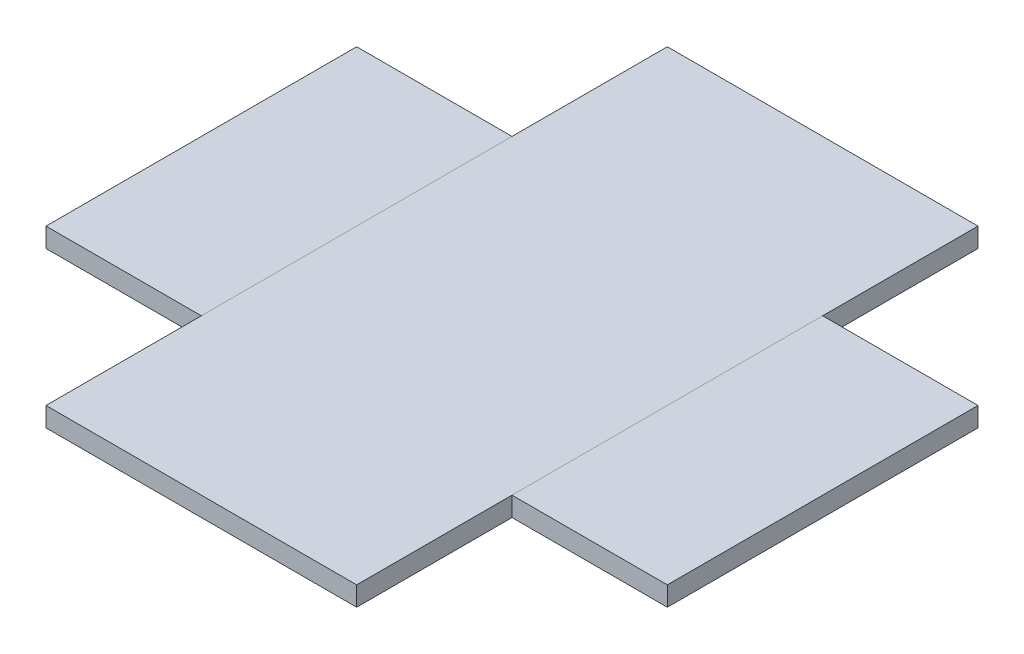
ISO-10303-21;
HEADER;
FILE_DESCRIPTION(('STEP AP214'),'2;1');
FILE_NAME('part.step','',(''),(''),'','','');
FILE_SCHEMA(('AUTOMOTIVE_DESIGN { 1 0 10303 214 1 1 1 1 }'));
ENDSEC;
DATA;
#1=APPLICATION_CONTEXT('core data for automotive mechanical design processes');
#2=APPLICATION_PROTOCOL_DEFINITION('international standard','automotive_design',2000,#1);
#3=PRODUCT_CONTEXT('',#1,'mechanical');
#4=PRODUCT('Part','Part','',(#3));
#5=PRODUCT_RELATED_PRODUCT_CATEGORY('part','',(#4));
#6=PRODUCT_DEFINITION_FORMATION('','',#4);
#7=PRODUCT_DEFINITION_CONTEXT('part definition',#1,'design');
#8=PRODUCT_DEFINITION('design','',#6,#7);
#9=PRODUCT_DEFINITION_SHAPE('','',#8);
#10=(LENGTH_UNIT() NAMED_UNIT(*) SI_UNIT(.MILLI.,.METRE.));
#11=(NAMED_UNIT(*) PLANE_ANGLE_UNIT() SI_UNIT($,.RADIAN.));
#12=(NAMED_UNIT(*) SI_UNIT($,.STERADIAN.) SOLID_ANGLE_UNIT());
#13=UNCERTAINTY_MEASURE_WITH_UNIT(LENGTH_MEASURE(1.E-05),#10,'distance_accuracy_value','');
#14=(GEOMETRIC_REPRESENTATION_CONTEXT(3) GLOBAL_UNCERTAINTY_ASSIGNED_CONTEXT((#13)) GLOBAL_UNIT_ASSIGNED_CONTEXT((#10,
#11,#12)) REPRESENTATION_CONTEXT('',''));
#15=CARTESIAN_POINT('',(0.,0.,0.));
#16=DIRECTION('',(0.,0.,1.));
#17=DIRECTION('',(1.,0.,0.));
#18=AXIS2_PLACEMENT_3D('',#15,#16,#17);
#19=CARTESIAN_POINT('',(0.,0.,0.));
#20=DIRECTION('',(0.,-1.,0.));
#21=DIRECTION('',(0.,0.,-1.));
#22=AXIS2_PLACEMENT_3D('',#19,#20,#21);
#23=PLANE('',#22);
#24=DIRECTION('',(0.,0.,-1.));
#25=VECTOR('',#24,1.);
#26=CARTESIAN_POINT('',(25.4,0.,50.8));
#27=LINE('',#26,#25);
#28=CARTESIAN_POINT('',(25.4,0.,50.8));
#29=VERTEX_POINT('',#28);
#30=CARTESIAN_POINT('',(25.4,0.,-50.8));
#31=VERTEX_POINT('',#30);
#32=EDGE_CURVE('E51',#29,#31,#27,.T.);
#33=ORIENTED_EDGE('',*,*,#32,.F.);
#34=DIRECTION('',(1.,0.,0.));
#35=VECTOR('',#34,1.);
#36=CARTESIAN_POINT('',(-25.4,0.,50.8));
#37=LINE('',#36,#35);
#38=CARTESIAN_POINT('',(-25.4,0.,50.8));
#39=VERTEX_POINT('',#38);
#40=EDGE_CURVE('E74',#39,#29,#37,.T.);
#41=ORIENTED_EDGE('',*,*,#40,.F.);
#42=DIRECTION('',(0.,0.,1.));
#43=VECTOR('',#42,1.);
#44=CARTESIAN_POINT('',(-25.4,0.,50.8));
#45=LINE('',#44,#43);
#46=CARTESIAN_POINT('',(-25.4,0.,-50.8));
#47=VERTEX_POINT('',#46);
#48=EDGE_CURVE('E79',#47,#39,#45,.T.);
#49=ORIENTED_EDGE('',*,*,#48,.F.);
#50=DIRECTION('',(-1.,0.,0.));
#51=VECTOR('',#50,1.);
#52=CARTESIAN_POINT('',(-25.4,0.,-50.8));
#53=LINE('',#52,#51);
#54=EDGE_CURVE('E94',#31,#47,#53,.T.);
#55=ORIENTED_EDGE('',*,*,#54,.F.);
#56=EDGE_LOOP('',(#33,#41,#49,#55));
#57=FACE_BOUND('',#56,.T.);
#58=ADVANCED_FACE('F43',(#57),#23,.T.);
#59=CARTESIAN_POINT('',(0.,3.175,0.));
#60=DIRECTION('',(0.,-1.,0.));
#61=DIRECTION('',(0.,0.,-1.));
#62=AXIS2_PLACEMENT_3D('',#59,#60,#61);
#63=PLANE('',#62);
#64=DIRECTION('',(0.,0.,-1.));
#65=VECTOR('',#64,1.);
#66=CARTESIAN_POINT('',(25.4,3.175,50.8));
#67=LINE('',#66,#65);
#68=CARTESIAN_POINT('',(25.4,3.175,50.8));
#69=VERTEX_POINT('',#68);
#70=CARTESIAN_POINT('',(25.4,3.175,-50.8));
#71=VERTEX_POINT('',#70);
#72=EDGE_CURVE('E103',#69,#71,#67,.T.);
#73=ORIENTED_EDGE('',*,*,#72,.T.);
#74=DIRECTION('',(-1.,0.,0.));
#75=VECTOR('',#74,1.);
#76=CARTESIAN_POINT('',(-25.4,3.175,-50.8));
#77=LINE('',#76,#75);
#78=CARTESIAN_POINT('',(-25.4,3.175,-50.8));
#79=VERTEX_POINT('',#78);
#80=EDGE_CURVE('E92',#71,#79,#77,.T.);
#81=ORIENTED_EDGE('',*,*,#80,.T.);
#82=DIRECTION('',(0.,0.,1.));
#83=VECTOR('',#82,1.);
#84=CARTESIAN_POINT('',(-25.4,3.175,50.8));
#85=LINE('',#84,#83);
#86=CARTESIAN_POINT('',(-25.4,3.175,50.8));
#87=VERTEX_POINT('',#86);
#88=EDGE_CURVE('E95',#79,#87,#85,.T.);
#89=ORIENTED_EDGE('',*,*,#88,.T.);
#90=DIRECTION('',(1.,0.,0.));
#91=VECTOR('',#90,1.);
#92=CARTESIAN_POINT('',(-25.4,3.175,50.8));
#93=LINE('',#92,#91);
#94=EDGE_CURVE('E100',#87,#69,#93,.T.);
#95=ORIENTED_EDGE('',*,*,#94,.T.);
#96=EDGE_LOOP('',(#73,#81,#89,#95));
#97=FACE_BOUND('',#96,.T.);
#98=ADVANCED_FACE('F102',(#97),#63,.F.);
#99=CARTESIAN_POINT('',(-25.4,-113.592253256989,-50.8));
#100=DIRECTION('',(0.,0.,-1.));
#101=DIRECTION('',(-1.,0.,0.));
#102=AXIS2_PLACEMENT_3D('',#99,#100,#101);
#103=PLANE('',#102);
#104=DIRECTION('',(0.,1.,0.));
#105=VECTOR('',#104,1.);
#106=CARTESIAN_POINT('',(25.4,-113.592253256989,-50.8));
#107=LINE('',#106,#105);
#108=EDGE_CURVE('E12',#31,#71,#107,.T.);
#109=ORIENTED_EDGE('',*,*,#108,.F.);
#110=ORIENTED_EDGE('',*,*,#54,.T.);
#111=DIRECTION('',(0.,1.,0.));
#112=VECTOR('',#111,1.);
#113=CARTESIAN_POINT('',(-25.4,-113.592253256989,-50.8));
#114=LINE('',#113,#112);
#115=EDGE_CURVE('E89',#47,#79,#114,.T.);
#116=ORIENTED_EDGE('',*,*,#115,.T.);
#117=ORIENTED_EDGE('',*,*,#80,.F.);
#118=EDGE_LOOP('',(#109,#110,#116,#117));
#119=FACE_BOUND('',#118,.T.);
#120=ADVANCED_FACE('F90',(#119),#103,.T.);
#121=CARTESIAN_POINT('',(-25.4,-113.592253256989,50.8));
#122=DIRECTION('',(-1.,0.,0.));
#123=DIRECTION('',(0.,0.,1.));
#124=AXIS2_PLACEMENT_3D('',#121,#122,#123);
#125=PLANE('',#124);
#126=ORIENTED_EDGE('',*,*,#115,.F.);
#127=ORIENTED_EDGE('',*,*,#48,.T.);
#128=DIRECTION('',(0.,1.,0.));
#129=VECTOR('',#128,1.);
#130=CARTESIAN_POINT('',(-25.4,-113.592253256989,50.8));
#131=LINE('',#130,#129);
#132=EDGE_CURVE('E84',#39,#87,#131,.T.);
#133=ORIENTED_EDGE('',*,*,#132,.T.);
#134=ORIENTED_EDGE('',*,*,#88,.F.);
#135=EDGE_LOOP('',(#126,#127,#133,#134));
#136=FACE_BOUND('',#135,.T.);
#137=ADVANCED_FACE('F96',(#136),#125,.T.);
#138=CARTESIAN_POINT('',(-25.4,-113.592253256989,50.8));
#139=DIRECTION('',(0.,0.,1.));
#140=DIRECTION('',(1.,0.,0.));
#141=AXIS2_PLACEMENT_3D('',#138,#139,#140);
#142=PLANE('',#141);
#143=ORIENTED_EDGE('',*,*,#132,.F.);
#144=ORIENTED_EDGE('',*,*,#40,.T.);
#145=DIRECTION('',(0.,1.,0.));
#146=VECTOR('',#145,1.);
#147=CARTESIAN_POINT('',(25.4,-113.592253256989,50.8));
#148=LINE('',#147,#146);
#149=EDGE_CURVE('E110',#29,#69,#148,.T.);
#150=ORIENTED_EDGE('',*,*,#149,.T.);
#151=ORIENTED_EDGE('',*,*,#94,.F.);
#152=EDGE_LOOP('',(#143,#144,#150,#151));
#153=FACE_BOUND('',#152,.T.);
#154=ADVANCED_FACE('F116',(#153),#142,.T.);
#155=CARTESIAN_POINT('',(25.4,-113.592253256989,50.8));
#156=DIRECTION('',(1.,0.,0.));
#157=DIRECTION('',(0.,0.,-1.));
#158=AXIS2_PLACEMENT_3D('',#155,#156,#157);
#159=PLANE('',#158);
#160=ORIENTED_EDGE('',*,*,#149,.F.);
#161=ORIENTED_EDGE('',*,*,#32,.T.);
#162=ORIENTED_EDGE('',*,*,#108,.T.);
#163=ORIENTED_EDGE('',*,*,#72,.F.);
#164=EDGE_LOOP('',(#160,#161,#162,#163));
#165=FACE_BOUND('',#164,.T.);
#166=ADVANCED_FACE('F117',(#165),#159,.T.);
#167=CLOSED_SHELL('',(#58,#98,#120,#137,#154,#166));
#168=MANIFOLD_SOLID_BREP('B2',#167);
#169=CARTESIAN_POINT('',(50.8,3.175,25.4));
#170=DIRECTION('',(-1.,0.,0.));
#171=DIRECTION('',(0.,0.,1.));
#172=AXIS2_PLACEMENT_3D('',#169,#170,#171);
#173=PLANE('',#172);
#174=DIRECTION('',(0.,0.,-1.));
#175=VECTOR('',#174,1.);
#176=CARTESIAN_POINT('',(50.8,0.,25.4));
#177=LINE('',#176,#175);
#178=CARTESIAN_POINT('',(50.8,0.,25.4));
#179=VERTEX_POINT('',#178);
#180=CARTESIAN_POINT('',(50.8,0.,-25.4));
#181=VERTEX_POINT('',#180);
#182=EDGE_CURVE('E230',#179,#181,#177,.T.);
#183=ORIENTED_EDGE('',*,*,#182,.T.);
#184=DIRECTION('',(0.,-1.,0.));
#185=VECTOR('',#184,1.);
#186=CARTESIAN_POINT('',(50.8,3.175,-25.4));
#187=LINE('',#186,#185);
#188=CARTESIAN_POINT('',(50.8,3.175,-25.4));
#189=VERTEX_POINT('',#188);
#190=EDGE_CURVE('E41',#189,#181,#187,.T.);
#191=ORIENTED_EDGE('',*,*,#190,.F.);
#192=DIRECTION('',(0.,0.,-1.));
#193=VECTOR('',#192,1.);
#194=CARTESIAN_POINT('',(50.8,3.175,25.4));
#195=LINE('',#194,#193);
#196=CARTESIAN_POINT('',(50.8,3.175,25.4));
#197=VERTEX_POINT('',#196);
#198=EDGE_CURVE('E218',#197,#189,#195,.T.);
#199=ORIENTED_EDGE('',*,*,#198,.F.);
#200=DIRECTION('',(0.,-1.,0.));
#201=VECTOR('',#200,1.);
#202=CARTESIAN_POINT('',(50.8,3.175,25.4));
#203=LINE('',#202,#201);
#204=EDGE_CURVE('E226',#197,#179,#203,.T.);
#205=ORIENTED_EDGE('',*,*,#204,.T.);
#206=EDGE_LOOP('',(#183,#191,#199,#205));
#207=FACE_BOUND('',#206,.T.);
#208=ADVANCED_FACE('F167',(#207),#173,.F.);
#209=CARTESIAN_POINT('',(-50.8,3.175,-25.4));
#210=DIRECTION('',(0.,0.,1.));
#211=DIRECTION('',(1.,0.,0.));
#212=AXIS2_PLACEMENT_3D('',#209,#210,#211);
#213=PLANE('',#212);
#214=DIRECTION('',(-1.,0.,0.));
#215=VECTOR('',#214,1.);
#216=CARTESIAN_POINT('',(-50.8,0.,-25.4));
#217=LINE('',#216,#215);
#218=CARTESIAN_POINT('',(-50.8,0.,-25.4));
#219=VERTEX_POINT('',#218);
#220=EDGE_CURVE('E222',#181,#219,#217,.T.);
#221=ORIENTED_EDGE('',*,*,#220,.T.);
#222=DIRECTION('',(0.,-1.,0.));
#223=VECTOR('',#222,1.);
#224=CARTESIAN_POINT('',(-50.8,3.175,-25.4));
#225=LINE('',#224,#223);
#226=CARTESIAN_POINT('',(-50.8,3.175,-25.4));
#227=VERTEX_POINT('',#226);
#228=EDGE_CURVE('E175',#227,#219,#225,.T.);
#229=ORIENTED_EDGE('',*,*,#228,.F.);
#230=DIRECTION('',(-1.,0.,0.));
#231=VECTOR('',#230,1.);
#232=CARTESIAN_POINT('',(-50.8,3.175,-25.4));
#233=LINE('',#232,#231);
#234=EDGE_CURVE('E213',#189,#227,#233,.T.);
#235=ORIENTED_EDGE('',*,*,#234,.F.);
#236=ORIENTED_EDGE('',*,*,#190,.T.);
#237=EDGE_LOOP('',(#221,#229,#235,#236));
#238=FACE_BOUND('',#237,.T.);
#239=ADVANCED_FACE('F221',(#238),#213,.F.);
#240=CARTESIAN_POINT('',(-50.8,3.175,25.4));
#241=DIRECTION('',(1.,0.,0.));
#242=DIRECTION('',(0.,0.,-1.));
#243=AXIS2_PLACEMENT_3D('',#240,#241,#242);
#244=PLANE('',#243);
#245=DIRECTION('',(0.,0.,1.));
#246=VECTOR('',#245,1.);
#247=CARTESIAN_POINT('',(-50.8,0.,25.4));
#248=LINE('',#247,#246);
#249=CARTESIAN_POINT('',(-50.8,0.,25.4));
#250=VERTEX_POINT('',#249);
#251=EDGE_CURVE('E200',#219,#250,#248,.T.);
#252=ORIENTED_EDGE('',*,*,#251,.T.);
#253=DIRECTION('',(0.,-1.,0.));
#254=VECTOR('',#253,1.);
#255=CARTESIAN_POINT('',(-50.8,3.175,25.4));
#256=LINE('',#255,#254);
#257=CARTESIAN_POINT('',(-50.8,3.175,25.4));
#258=VERTEX_POINT('',#257);
#259=EDGE_CURVE('E223',#258,#250,#256,.T.);
#260=ORIENTED_EDGE('',*,*,#259,.F.);
#261=DIRECTION('',(0.,0.,1.));
#262=VECTOR('',#261,1.);
#263=CARTESIAN_POINT('',(-50.8,3.175,25.4));
#264=LINE('',#263,#262);
#265=EDGE_CURVE('E216',#227,#258,#264,.T.);
#266=ORIENTED_EDGE('',*,*,#265,.F.);
#267=ORIENTED_EDGE('',*,*,#228,.T.);
#268=EDGE_LOOP('',(#252,#260,#266,#267));
#269=FACE_BOUND('',#268,.T.);
#270=ADVANCED_FACE('F224',(#269),#244,.F.);
#271=CARTESIAN_POINT('',(-50.8,3.175,25.4));
#272=DIRECTION('',(0.,0.,-1.));
#273=DIRECTION('',(-1.,0.,0.));
#274=AXIS2_PLACEMENT_3D('',#271,#272,#273);
#275=PLANE('',#274);
#276=DIRECTION('',(1.,0.,0.));
#277=VECTOR('',#276,1.);
#278=CARTESIAN_POINT('',(-50.8,0.,25.4));
#279=LINE('',#278,#277);
#280=EDGE_CURVE('E206',#250,#179,#279,.T.);
#281=ORIENTED_EDGE('',*,*,#280,.T.);
#282=ORIENTED_EDGE('',*,*,#204,.F.);
#283=DIRECTION('',(1.,0.,0.));
#284=VECTOR('',#283,1.);
#285=CARTESIAN_POINT('',(-50.8,3.175,25.4));
#286=LINE('',#285,#284);
#287=EDGE_CURVE('E183',#258,#197,#286,.T.);
#288=ORIENTED_EDGE('',*,*,#287,.F.);
#289=ORIENTED_EDGE('',*,*,#259,.T.);
#290=EDGE_LOOP('',(#281,#282,#288,#289));
#291=FACE_BOUND('',#290,.T.);
#292=ADVANCED_FACE('F237',(#291),#275,.F.);
#293=CARTESIAN_POINT('',(0.,3.175,0.));
#294=DIRECTION('',(0.,-1.,0.));
#295=DIRECTION('',(0.,0.,-1.));
#296=AXIS2_PLACEMENT_3D('',#293,#294,#295);
#297=PLANE('',#296);
#298=ORIENTED_EDGE('',*,*,#198,.T.);
#299=ORIENTED_EDGE('',*,*,#234,.T.);
#300=ORIENTED_EDGE('',*,*,#265,.T.);
#301=ORIENTED_EDGE('',*,*,#287,.T.);
#302=EDGE_LOOP('',(#298,#299,#300,#301));
#303=FACE_BOUND('',#302,.T.);
#304=ADVANCED_FACE('F214',(#303),#297,.F.);
#305=CARTESIAN_POINT('',(0.,0.,0.));
#306=DIRECTION('',(0.,-1.,0.));
#307=DIRECTION('',(0.,0.,-1.));
#308=AXIS2_PLACEMENT_3D('',#305,#306,#307);
#309=PLANE('',#308);
#310=ORIENTED_EDGE('',*,*,#182,.F.);
#311=ORIENTED_EDGE('',*,*,#280,.F.);
#312=ORIENTED_EDGE('',*,*,#251,.F.);
#313=ORIENTED_EDGE('',*,*,#220,.F.);
#314=EDGE_LOOP('',(#310,#311,#312,#313));
#315=FACE_BOUND('',#314,.T.);
#316=ADVANCED_FACE('F240',(#315),#309,.T.);
#317=CLOSED_SHELL('',(#208,#239,#270,#292,#304,#316));
#318=MANIFOLD_SOLID_BREP('B6',#317);
#319=ADVANCED_BREP_SHAPE_REPRESENTATION('',(#18,#168,#318),#14);
#320=SHAPE_DEFINITION_REPRESENTATION(#9,#319);
ENDSEC;
END-ISO-10303-21;
